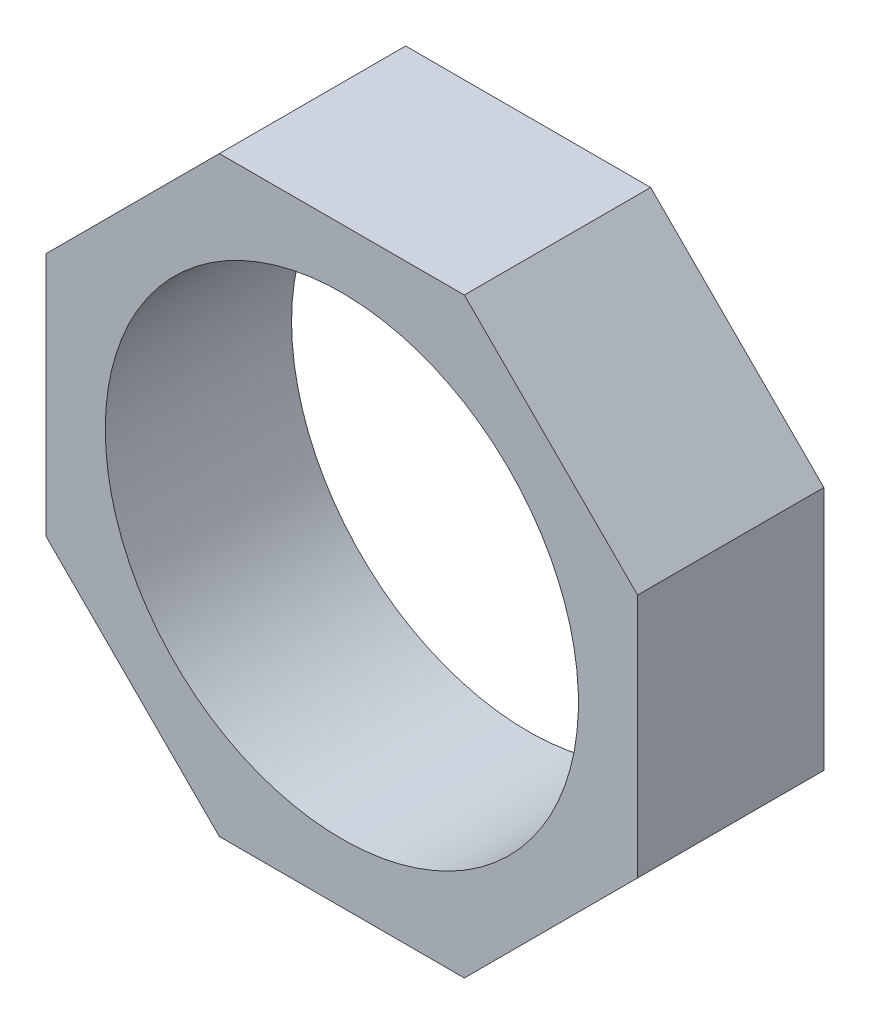
ISO-10303-21;
HEADER;
FILE_DESCRIPTION(('STEP AP214'),'2;1');
FILE_NAME('part.step','',(''),(''),'','','');
FILE_SCHEMA(('AUTOMOTIVE_DESIGN { 1 0 10303 214 1 1 1 1 }'));
ENDSEC;
DATA;
#1=APPLICATION_CONTEXT('core data for automotive mechanical design processes');
#2=APPLICATION_PROTOCOL_DEFINITION('international standard','automotive_design',2000,#1);
#3=PRODUCT_CONTEXT('',#1,'mechanical');
#4=PRODUCT('Part','Part','',(#3));
#5=PRODUCT_RELATED_PRODUCT_CATEGORY('part','',(#4));
#6=PRODUCT_DEFINITION_FORMATION('','',#4);
#7=PRODUCT_DEFINITION_CONTEXT('part definition',#1,'design');
#8=PRODUCT_DEFINITION('design','',#6,#7);
#9=PRODUCT_DEFINITION_SHAPE('','',#8);
#10=(LENGTH_UNIT() NAMED_UNIT(*) SI_UNIT(.MILLI.,.METRE.));
#11=(NAMED_UNIT(*) PLANE_ANGLE_UNIT() SI_UNIT($,.RADIAN.));
#12=(NAMED_UNIT(*) SI_UNIT($,.STERADIAN.) SOLID_ANGLE_UNIT());
#13=UNCERTAINTY_MEASURE_WITH_UNIT(LENGTH_MEASURE(1.E-05),#10,'distance_accuracy_value','');
#14=(GEOMETRIC_REPRESENTATION_CONTEXT(3) GLOBAL_UNCERTAINTY_ASSIGNED_CONTEXT((#13)) GLOBAL_UNIT_ASSIGNED_CONTEXT((#10,
#11,#12)) REPRESENTATION_CONTEXT('',''));
#15=CARTESIAN_POINT('',(0.,0.,0.));
#16=DIRECTION('',(0.,0.,1.));
#17=DIRECTION('',(1.,0.,0.));
#18=AXIS2_PLACEMENT_3D('',#15,#16,#17);
#19=CARTESIAN_POINT('',(58.071160524975,83.000046401066,0.649999952316));
#20=DIRECTION('',(-1.19248806385E-08,1.,0.));
#21=DIRECTION('',(-1.,-1.19248806385E-08,0.));
#22=AXIS2_PLACEMENT_3D('',#19,#20,#21);
#23=PLANE('',#22);
#24=DIRECTION('',(1.,0.,0.));
#25=VECTOR('',#24,1.);
#26=CARTESIAN_POINT('',(48.929024960872,83.000046401066,3.799999952316));
#27=LINE('',#26,#25);
#28=CARTESIAN_POINT('',(58.071160524975,83.000046401066,3.799999952316));
#29=VERTEX_POINT('',#28);
#30=CARTESIAN_POINT('',(53.9290249135936,83.0000463640202,3.799999952316));
#31=VERTEX_POINT('',#30);
#32=EDGE_CURVE('E131',#29,#31,#27,.F.);
#33=ORIENTED_EDGE('',*,*,#32,.F.);
#34=DIRECTION('',(0.,0.,1.));
#35=VECTOR('',#34,1.);
#36=CARTESIAN_POINT('',(58.071160524975,83.000046401066,0.649999952316));
#37=LINE('',#36,#35);
#38=CARTESIAN_POINT('',(58.071160524975,83.000046401066,0.649999952316));
#39=VERTEX_POINT('',#38);
#40=EDGE_CURVE('E105',#39,#29,#37,.T.);
#41=ORIENTED_EDGE('',*,*,#40,.F.);
#42=DIRECTION('',(1.,0.,0.));
#43=VECTOR('',#42,1.);
#44=CARTESIAN_POINT('',(48.929024960872,83.000046401066,0.649999952316));
#45=LINE('',#44,#43);
#46=CARTESIAN_POINT('',(53.9290249135936,83.0000463640202,0.649999952316));
#47=VERTEX_POINT('',#46);
#48=EDGE_CURVE('E129',#39,#47,#45,.F.);
#49=ORIENTED_EDGE('',*,*,#48,.T.);
#50=DIRECTION('',(0.,0.,1.));
#51=VECTOR('',#50,1.);
#52=CARTESIAN_POINT('',(53.9290249012444,83.0000463516716,0.649999952316));
#53=LINE('',#52,#51);
#54=EDGE_CURVE('E118',#31,#47,#53,.F.);
#55=ORIENTED_EDGE('',*,*,#54,.F.);
#56=EDGE_LOOP('',(#33,#41,#49,#55));
#57=FACE_BOUND('',#56,.T.);
#58=ADVANCED_FACE('F17',(#57),#23,.T.);
#59=CARTESIAN_POINT('',(51.000092748038,80.071114128608,0.649999952316));
#60=DIRECTION('',(-0.707106789619047,0.707106772754048,0.));
#61=DIRECTION('',(-0.707106772754048,-0.707106789619047,0.));
#62=AXIS2_PLACEMENT_3D('',#59,#60,#61);
#63=PLANE('',#62);
#64=DIRECTION('',(-0.707106772754181,-0.707106789618914,0.));
#65=VECTOR('',#64,1.);
#66=CARTESIAN_POINT('',(53.929024901245,83.000046351671,0.649999952316));
#67=LINE('',#66,#65);
#68=CARTESIAN_POINT('',(51.000092748038,80.071114128608,0.649999952316));
#69=VERTEX_POINT('',#68);
#70=EDGE_CURVE('E123',#47,#69,#67,.T.);
#71=ORIENTED_EDGE('',*,*,#70,.T.);
#72=DIRECTION('',(0.,0.,1.));
#73=VECTOR('',#72,1.);
#74=CARTESIAN_POINT('',(51.000092748038,80.071114128608,0.649999952316));
#75=LINE('',#74,#73);
#76=CARTESIAN_POINT('',(51.000092748038,80.071114128608,3.799999952316));
#77=VERTEX_POINT('',#76);
#78=EDGE_CURVE('E78',#77,#69,#75,.F.);
#79=ORIENTED_EDGE('',*,*,#78,.F.);
#80=DIRECTION('',(-0.707106772754181,-0.707106789618914,0.));
#81=VECTOR('',#80,1.);
#82=CARTESIAN_POINT('',(53.929024901245,83.000046351671,3.799999952316));
#83=LINE('',#82,#81);
#84=EDGE_CURVE('E124',#31,#77,#83,.T.);
#85=ORIENTED_EDGE('',*,*,#84,.F.);
#86=ORIENTED_EDGE('',*,*,#54,.T.);
#87=EDGE_LOOP('',(#71,#79,#85,#86));
#88=FACE_BOUND('',#87,.T.);
#89=ADVANCED_FACE('F122',(#88),#63,.T.);
#90=CARTESIAN_POINT('',(51.000092748038,80.071114128608,0.649999952316));
#91=DIRECTION('',(-1.,-1.19248806385E-08,0.));
#92=DIRECTION('',(1.19248806385E-08,-1.,0.));
#93=AXIS2_PLACEMENT_3D('',#90,#91,#92);
#94=PLANE('',#93);
#95=DIRECTION('',(0.,1.,0.));
#96=VECTOR('',#95,1.);
#97=CARTESIAN_POINT('',(51.000092748038,78.000046292046,0.649999952316));
#98=LINE('',#97,#96);
#99=CARTESIAN_POINT('',(51.0000927850844,75.9289785172261,0.649999952316));
#100=VERTEX_POINT('',#99);
#101=EDGE_CURVE('E98',#69,#100,#98,.F.);
#102=ORIENTED_EDGE('',*,*,#101,.T.);
#103=DIRECTION('',(0.,0.,1.));
#104=VECTOR('',#103,1.);
#105=CARTESIAN_POINT('',(51.0000927974346,75.9289785048786,0.649999952316));
#106=LINE('',#105,#104);
#107=CARTESIAN_POINT('',(51.0000927850844,75.9289785172261,3.799999952316));
#108=VERTEX_POINT('',#107);
#109=EDGE_CURVE('E85',#108,#100,#106,.F.);
#110=ORIENTED_EDGE('',*,*,#109,.F.);
#111=DIRECTION('',(0.,1.,0.));
#112=VECTOR('',#111,1.);
#113=CARTESIAN_POINT('',(51.000092748038,78.000046292046,3.799999952316));
#114=LINE('',#113,#112);
#115=EDGE_CURVE('E152',#77,#108,#114,.F.);
#116=ORIENTED_EDGE('',*,*,#115,.F.);
#117=ORIENTED_EDGE('',*,*,#78,.T.);
#118=EDGE_LOOP('',(#102,#110,#116,#117));
#119=FACE_BOUND('',#118,.T.);
#120=ADVANCED_FACE('F104',(#119),#94,.T.);
#121=CARTESIAN_POINT('',(53.929025020493,73.000046351669,0.649999952316));
#122=DIRECTION('',(-0.707106772755048,-0.707106789618048,0.));
#123=DIRECTION('',(0.707106789618048,-0.707106772755048,0.));
#124=AXIS2_PLACEMENT_3D('',#121,#122,#123);
#125=PLANE('',#124);
#126=DIRECTION('',(0.707106789618431,-0.707106772754664,0.));
#127=VECTOR('',#126,1.);
#128=CARTESIAN_POINT('',(51.000092797433,75.928978504877,0.649999952316));
#129=LINE('',#128,#127);
#130=CARTESIAN_POINT('',(53.929025020493,73.000046351669,0.649999952316));
#131=VERTEX_POINT('',#130);
#132=EDGE_CURVE('E89',#100,#131,#129,.T.);
#133=ORIENTED_EDGE('',*,*,#132,.T.);
#134=DIRECTION('',(0.,0.,1.));
#135=VECTOR('',#134,1.);
#136=CARTESIAN_POINT('',(53.929025020493,73.000046351669,0.649999952316));
#137=LINE('',#136,#135);
#138=CARTESIAN_POINT('',(53.929025020493,73.000046351669,3.799999952316));
#139=VERTEX_POINT('',#138);
#140=EDGE_CURVE('E91',#139,#131,#137,.F.);
#141=ORIENTED_EDGE('',*,*,#140,.F.);
#142=DIRECTION('',(0.707106789618431,-0.707106772754664,0.));
#143=VECTOR('',#142,1.);
#144=CARTESIAN_POINT('',(51.000092797433,75.928978504877,3.799999952316));
#145=LINE('',#144,#143);
#146=EDGE_CURVE('E90',#108,#139,#145,.T.);
#147=ORIENTED_EDGE('',*,*,#146,.F.);
#148=ORIENTED_EDGE('',*,*,#109,.T.);
#149=EDGE_LOOP('',(#133,#141,#147,#148));
#150=FACE_BOUND('',#149,.T.);
#151=ADVANCED_FACE('F87',(#150),#125,.T.);
#152=CARTESIAN_POINT('',(53.929025020493,73.000046351669,0.649999952316));
#153=DIRECTION('',(1.19248806385E-08,-1.,0.));
#154=DIRECTION('',(1.,1.19248806385E-08,0.));
#155=AXIS2_PLACEMENT_3D('',#152,#153,#154);
#156=PLANE('',#155);
#157=DIRECTION('',(1.,0.,0.));
#158=VECTOR('',#157,1.);
#159=CARTESIAN_POINT('',(48.929024960872,73.000046351669,3.799999952316));
#160=LINE('',#159,#158);
#161=CARTESIAN_POINT('',(58.0711606318755,73.0000463887147,3.799999952316));
#162=VERTEX_POINT('',#161);
#163=EDGE_CURVE('E148',#139,#162,#160,.T.);
#164=ORIENTED_EDGE('',*,*,#163,.F.);
#165=ORIENTED_EDGE('',*,*,#140,.T.);
#166=DIRECTION('',(1.,0.,0.));
#167=VECTOR('',#166,1.);
#168=CARTESIAN_POINT('',(48.929024960872,73.000046351669,0.649999952316));
#169=LINE('',#168,#167);
#170=CARTESIAN_POINT('',(58.0711606318755,73.0000463887147,0.649999952316));
#171=VERTEX_POINT('',#170);
#172=EDGE_CURVE('E102',#131,#171,#169,.T.);
#173=ORIENTED_EDGE('',*,*,#172,.T.);
#174=DIRECTION('',(0.,0.,1.));
#175=VECTOR('',#174,1.);
#176=CARTESIAN_POINT('',(58.0711606442241,73.0000464010629,0.649999952316));
#177=LINE('',#176,#175);
#178=EDGE_CURVE('E114',#162,#171,#177,.F.);
#179=ORIENTED_EDGE('',*,*,#178,.F.);
#180=EDGE_LOOP('',(#164,#165,#173,#179));
#181=FACE_BOUND('',#180,.T.);
#182=ADVANCED_FACE('F146',(#181),#156,.T.);
#183=CARTESIAN_POINT('',(61.00009279743,75.928978624126,0.649999952316));
#184=DIRECTION('',(0.707106789619047,-0.707106772754048,0.));
#185=DIRECTION('',(0.707106772754048,0.707106789619047,0.));
#186=AXIS2_PLACEMENT_3D('',#183,#184,#185);
#187=PLANE('',#186);
#188=DIRECTION('',(0.707106772754061,0.707106789619034,0.));
#189=VECTOR('',#188,1.);
#190=CARTESIAN_POINT('',(58.071160644224,73.000046401063,0.649999952316));
#191=LINE('',#190,#189);
#192=CARTESIAN_POINT('',(61.00009279743,75.928978624126,0.649999952316));
#193=VERTEX_POINT('',#192);
#194=EDGE_CURVE('E141',#171,#193,#191,.T.);
#195=ORIENTED_EDGE('',*,*,#194,.T.);
#196=DIRECTION('',(0.,0.,1.));
#197=VECTOR('',#196,1.);
#198=CARTESIAN_POINT('',(61.00009279743,75.928978624126,0.649999952316));
#199=LINE('',#198,#197);
#200=CARTESIAN_POINT('',(61.00009279743,75.928978624126,3.799999952316));
#201=VERTEX_POINT('',#200);
#202=EDGE_CURVE('E112',#201,#193,#199,.F.);
#203=ORIENTED_EDGE('',*,*,#202,.F.);
#204=DIRECTION('',(0.707106772754061,0.707106789619034,0.));
#205=VECTOR('',#204,1.);
#206=CARTESIAN_POINT('',(58.071160644224,73.000046401063,3.799999952316));
#207=LINE('',#206,#205);
#208=EDGE_CURVE('E149',#162,#201,#207,.T.);
#209=ORIENTED_EDGE('',*,*,#208,.F.);
#210=ORIENTED_EDGE('',*,*,#178,.T.);
#211=EDGE_LOOP('',(#195,#203,#209,#210));
#212=FACE_BOUND('',#211,.T.);
#213=ADVANCED_FACE('F186',(#212),#187,.T.);
#214=CARTESIAN_POINT('',(61.00009279743,75.928978624126,0.649999952316));
#215=DIRECTION('',(1.,1.19248804291E-08,0.));
#216=DIRECTION('',(-1.19248804291E-08,1.,0.));
#217=AXIS2_PLACEMENT_3D('',#214,#215,#216);
#218=PLANE('',#217);
#219=DIRECTION('',(0.,1.,0.));
#220=VECTOR('',#219,1.);
#221=CARTESIAN_POINT('',(61.00009279743,78.000046292046,0.649999952316));
#222=LINE('',#221,#220);
#223=CARTESIAN_POINT('',(61.0000927603839,80.0711142355081,0.649999952316));
#224=VERTEX_POINT('',#223);
#225=EDGE_CURVE('E135',#193,#224,#222,.T.);
#226=ORIENTED_EDGE('',*,*,#225,.T.);
#227=DIRECTION('',(0.,0.,1.));
#228=VECTOR('',#227,1.);
#229=CARTESIAN_POINT('',(61.0000927480344,80.0711142478554,0.649999952316));
#230=LINE('',#229,#228);
#231=CARTESIAN_POINT('',(61.0000927603839,80.0711142355081,3.799999952316));
#232=VERTEX_POINT('',#231);
#233=EDGE_CURVE('E107',#232,#224,#230,.F.);
#234=ORIENTED_EDGE('',*,*,#233,.F.);
#235=DIRECTION('',(0.,1.,0.));
#236=VECTOR('',#235,1.);
#237=CARTESIAN_POINT('',(61.00009279743,78.000046292046,3.799999952316));
#238=LINE('',#237,#236);
#239=EDGE_CURVE('E33',#201,#232,#238,.T.);
#240=ORIENTED_EDGE('',*,*,#239,.F.);
#241=ORIENTED_EDGE('',*,*,#202,.T.);
#242=EDGE_LOOP('',(#226,#234,#240,#241));
#243=FACE_BOUND('',#242,.T.);
#244=ADVANCED_FACE('F183',(#243),#218,.T.);
#245=CARTESIAN_POINT('',(58.071160524975,83.000046401066,0.649999952316));
#246=DIRECTION('',(0.707106772755048,0.707106789618048,0.));
#247=DIRECTION('',(-0.707106789618048,0.707106772755048,0.));
#248=AXIS2_PLACEMENT_3D('',#245,#246,#247);
#249=PLANE('',#248);
#250=DIRECTION('',(-0.70710678961843,0.707106772754665,0.));
#251=VECTOR('',#250,1.);
#252=CARTESIAN_POINT('',(61.000092748036,80.071114247857,0.649999952316));
#253=LINE('',#252,#251);
#254=EDGE_CURVE('E133',#224,#39,#253,.T.);
#255=ORIENTED_EDGE('',*,*,#254,.T.);
#256=ORIENTED_EDGE('',*,*,#40,.T.);
#257=DIRECTION('',(-0.70710678961843,0.707106772754665,0.));
#258=VECTOR('',#257,1.);
#259=CARTESIAN_POINT('',(61.000092748036,80.071114247857,3.799999952316));
#260=LINE('',#259,#258);
#261=EDGE_CURVE('E160',#232,#29,#260,.T.);
#262=ORIENTED_EDGE('',*,*,#261,.F.);
#263=ORIENTED_EDGE('',*,*,#233,.T.);
#264=EDGE_LOOP('',(#255,#256,#262,#263));
#265=FACE_BOUND('',#264,.T.);
#266=ADVANCED_FACE('F180',(#265),#249,.T.);
#267=CARTESIAN_POINT('',(48.929024960872,78.000046292046,0.649999952316));
#268=DIRECTION('',(0.,0.,1.));
#269=DIRECTION('',(1.,0.,0.));
#270=AXIS2_PLACEMENT_3D('',#267,#268,#269);
#271=PLANE('',#270);
#272=CARTESIAN_POINT('',(56.000092772734,78.000046376367,0.649999952316));
#273=DIRECTION('',(0.,0.,-1.));
#274=DIRECTION('',(-1.,0.,0.));
#275=AXIS2_PLACEMENT_3D('',#272,#273,#274);
#276=CIRCLE('',#275,4.);
#277=CARTESIAN_POINT('',(52.000092772734,78.000046376367,0.649999952316));
#278=VERTEX_POINT('',#277);
#279=EDGE_CURVE('E20',#278,#278,#276,.F.);
#280=ORIENTED_EDGE('',*,*,#279,.T.);
#281=EDGE_LOOP('',(#280));
#282=FACE_BOUND('',#281,.T.);
#283=ORIENTED_EDGE('',*,*,#48,.F.);
#284=ORIENTED_EDGE('',*,*,#254,.F.);
#285=ORIENTED_EDGE('',*,*,#225,.F.);
#286=ORIENTED_EDGE('',*,*,#194,.F.);
#287=ORIENTED_EDGE('',*,*,#172,.F.);
#288=ORIENTED_EDGE('',*,*,#132,.F.);
#289=ORIENTED_EDGE('',*,*,#101,.F.);
#290=ORIENTED_EDGE('',*,*,#70,.F.);
#291=EDGE_LOOP('',(#283,#284,#285,#286,#287,#288,#289,#290));
#292=FACE_BOUND('',#291,.T.);
#293=ADVANCED_FACE('F96',(#282,#292),#271,.F.);
#294=CARTESIAN_POINT('',(48.929024960872,78.000046292046,3.799999952316));
#295=DIRECTION('',(0.,0.,1.));
#296=DIRECTION('',(1.,0.,0.));
#297=AXIS2_PLACEMENT_3D('',#294,#295,#296);
#298=PLANE('',#297);
#299=ORIENTED_EDGE('',*,*,#239,.T.);
#300=ORIENTED_EDGE('',*,*,#261,.T.);
#301=ORIENTED_EDGE('',*,*,#32,.T.);
#302=ORIENTED_EDGE('',*,*,#84,.T.);
#303=ORIENTED_EDGE('',*,*,#115,.T.);
#304=ORIENTED_EDGE('',*,*,#146,.T.);
#305=ORIENTED_EDGE('',*,*,#163,.T.);
#306=ORIENTED_EDGE('',*,*,#208,.T.);
#307=EDGE_LOOP('',(#299,#300,#301,#302,#303,#304,#305,#306));
#308=FACE_BOUND('',#307,.T.);
#309=CARTESIAN_POINT('',(56.000092772734,78.000046376367,3.799999952316));
#310=DIRECTION('',(0.,0.,-1.));
#311=DIRECTION('',(-1.,0.,0.));
#312=AXIS2_PLACEMENT_3D('',#309,#310,#311);
#313=CIRCLE('',#312,4.);
#314=CARTESIAN_POINT('',(52.000092772734,78.000046376367,3.799999952316));
#315=VERTEX_POINT('',#314);
#316=EDGE_CURVE('E11',#315,#315,#313,.T.);
#317=ORIENTED_EDGE('',*,*,#316,.T.);
#318=EDGE_LOOP('',(#317));
#319=FACE_BOUND('',#318,.T.);
#320=ADVANCED_FACE('F157',(#308,#319),#298,.T.);
#321=CARTESIAN_POINT('',(56.000092772734,78.000046376367,0.649999952316));
#322=DIRECTION('',(0.,0.,-1.));
#323=DIRECTION('',(-1.,0.,0.));
#324=AXIS2_PLACEMENT_3D('',#321,#322,#323);
#325=CYLINDRICAL_SURFACE('',#324,4.);
#326=ORIENTED_EDGE('',*,*,#316,.F.);
#327=EDGE_LOOP('',(#326));
#328=FACE_BOUND('',#327,.T.);
#329=ORIENTED_EDGE('',*,*,#279,.F.);
#330=EDGE_LOOP('',(#329));
#331=FACE_BOUND('',#330,.T.);
#332=ADVANCED_FACE('F167',(#328,#331),#325,.F.);
#333=CLOSED_SHELL('',(#58,#89,#120,#151,#182,#213,#244,#266,#293,#320,#332));
#334=MANIFOLD_SOLID_BREP('B1',#333);
#335=ADVANCED_BREP_SHAPE_REPRESENTATION('',(#18,#334),#14);
#336=SHAPE_DEFINITION_REPRESENTATION(#9,#335);
ENDSEC;
END-ISO-10303-21;
